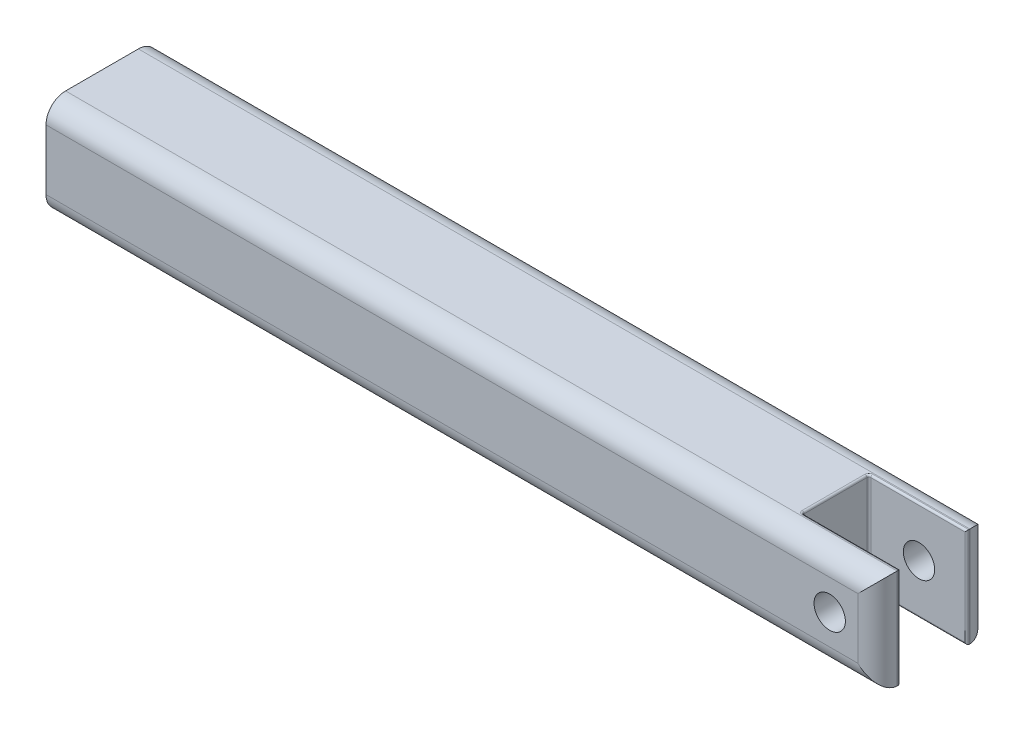
ISO-10303-21;
HEADER;
FILE_DESCRIPTION(('STEP AP214'),'2;1');
FILE_NAME('part.step','',(''),(''),'','','');
FILE_SCHEMA(('AUTOMOTIVE_DESIGN { 1 0 10303 214 1 1 1 1 }'));
ENDSEC;
DATA;
#1=APPLICATION_CONTEXT('core data for automotive mechanical design processes');
#2=APPLICATION_PROTOCOL_DEFINITION('international standard','automotive_design',2000,#1);
#3=PRODUCT_CONTEXT('',#1,'mechanical');
#4=PRODUCT('Part','Part','',(#3));
#5=PRODUCT_RELATED_PRODUCT_CATEGORY('part','',(#4));
#6=PRODUCT_DEFINITION_FORMATION('','',#4);
#7=PRODUCT_DEFINITION_CONTEXT('part definition',#1,'design');
#8=PRODUCT_DEFINITION('design','',#6,#7);
#9=PRODUCT_DEFINITION_SHAPE('','',#8);
#10=(LENGTH_UNIT() NAMED_UNIT(*) SI_UNIT(.MILLI.,.METRE.));
#11=(NAMED_UNIT(*) PLANE_ANGLE_UNIT() SI_UNIT($,.RADIAN.));
#12=(NAMED_UNIT(*) SI_UNIT($,.STERADIAN.) SOLID_ANGLE_UNIT());
#13=UNCERTAINTY_MEASURE_WITH_UNIT(LENGTH_MEASURE(1.E-05),#10,'distance_accuracy_value','');
#14=(GEOMETRIC_REPRESENTATION_CONTEXT(3) GLOBAL_UNCERTAINTY_ASSIGNED_CONTEXT((#13)) GLOBAL_UNIT_ASSIGNED_CONTEXT((#10,
#11,#12)) REPRESENTATION_CONTEXT('',''));
#15=CARTESIAN_POINT('',(0.,0.,0.));
#16=DIRECTION('',(0.,0.,1.));
#17=DIRECTION('',(1.,0.,0.));
#18=AXIS2_PLACEMENT_3D('',#15,#16,#17);
#19=CARTESIAN_POINT('',(106.1,-12.7,14.2875));
#20=DIRECTION('',(-1.,0.,0.));
#21=DIRECTION('',(0.,0.,1.));
#22=AXIS2_PLACEMENT_3D('',#19,#20,#21);
#23=PLANE('',#22);
#24=DIRECTION('',(0.,0.,-1.));
#25=VECTOR('',#24,1.);
#26=CARTESIAN_POINT('',(106.1,-12.7,14.2875));
#27=LINE('',#26,#25);
#28=CARTESIAN_POINT('',(106.1,-12.7,9.2875));
#29=VERTEX_POINT('',#28);
#30=CARTESIAN_POINT('',(106.1,-12.7,9.00000000000001));
#31=VERTEX_POINT('',#30);
#32=EDGE_CURVE('E217',#29,#31,#27,.T.);
#33=ORIENTED_EDGE('',*,*,#32,.T.);
#34=DIRECTION('',(0.,1.,0.));
#35=VECTOR('',#34,1.);
#36=CARTESIAN_POINT('',(106.1,-12.7,9.00000000000001));
#37=LINE('',#36,#35);
#38=CARTESIAN_POINT('',(106.1,12.7,9.00000000000001));
#39=VERTEX_POINT('',#38);
#40=EDGE_CURVE('E294',#31,#39,#37,.T.);
#41=ORIENTED_EDGE('',*,*,#40,.T.);
#42=DIRECTION('',(0.,0.,-1.));
#43=VECTOR('',#42,1.);
#44=CARTESIAN_POINT('',(106.1,12.7,14.2875));
#45=LINE('',#44,#43);
#46=CARTESIAN_POINT('',(106.1,12.7,9.2875));
#47=VERTEX_POINT('',#46);
#48=EDGE_CURVE('E185',#47,#39,#45,.T.);
#49=ORIENTED_EDGE('',*,*,#48,.F.);
#50=DIRECTION('',(0.,1.,0.));
#51=VECTOR('',#50,1.);
#52=CARTESIAN_POINT('',(106.1,-12.7,9.2875));
#53=LINE('',#52,#51);
#54=EDGE_CURVE('E233',#47,#29,#53,.F.);
#55=ORIENTED_EDGE('',*,*,#54,.T.);
#56=EDGE_LOOP('',(#33,#41,#49,#55));
#57=FACE_BOUND('',#56,.T.);
#58=ADVANCED_FACE('F33',(#57),#23,.F.);
#59=CARTESIAN_POINT('',(93.9,0.,-14.2875));
#60=DIRECTION('',(0.,0.,1.));
#61=DIRECTION('',(1.,0.,0.));
#62=AXIS2_PLACEMENT_3D('',#59,#60,#61);
#63=CYLINDRICAL_SURFACE('',#62,4.00000000000001);
#64=CARTESIAN_POINT('',(93.9,0.,8.50000000000001));
#65=DIRECTION('',(0.,0.,1.));
#66=DIRECTION('',(1.,0.,0.));
#67=AXIS2_PLACEMENT_3D('',#64,#65,#66);
#68=CIRCLE('',#67,4.00000000000001);
#69=CARTESIAN_POINT('',(97.9,0.,8.50000000000001));
#70=VERTEX_POINT('',#69);
#71=EDGE_CURVE('E220',#70,#70,#68,.F.);
#72=CARTESIAN_POINT('',(93.9,0.,14.2875));
#73=DIRECTION('',(0.,0.,1.));
#74=DIRECTION('',(1.,0.,0.));
#75=AXIS2_PLACEMENT_3D('',#72,#73,#74);
#76=CIRCLE('',#75,4.00000000000001);
#77=CARTESIAN_POINT('',(97.9,0.,14.2875));
#78=VERTEX_POINT('',#77);
#79=EDGE_CURVE('E380',#78,#78,#76,.T.);
#80=CARTESIAN_POINT('',(97.9,0.,8.50000000000001));
#81=CARTESIAN_POINT('',(97.9,0.,8.56028645833334));
#82=CARTESIAN_POINT('',(97.9,0.,8.62057291666668));
#83=CARTESIAN_POINT('',(97.9,0.,8.74114583333334));
#84=CARTESIAN_POINT('',(97.9,0.,8.80143229166668));
#85=CARTESIAN_POINT('',(97.9,0.,8.92200520833334));
#86=CARTESIAN_POINT('',(97.9,0.,8.98229166666668));
#87=CARTESIAN_POINT('',(97.9,0.,9.10286458333334));
#88=CARTESIAN_POINT('',(97.9,0.,9.16315104166668));
#89=CARTESIAN_POINT('',(97.9,0.,9.28372395833334));
#90=CARTESIAN_POINT('',(97.9,0.,9.34401041666668));
#91=CARTESIAN_POINT('',(97.9,0.,9.46458333333334));
#92=CARTESIAN_POINT('',(97.9,0.,9.52486979166667));
#93=CARTESIAN_POINT('',(97.9,0.,9.64544270833334));
#94=CARTESIAN_POINT('',(97.9,0.,9.70572916666667));
#95=CARTESIAN_POINT('',(97.9,0.,9.82630208333334));
#96=CARTESIAN_POINT('',(97.9,0.,9.88658854166668));
#97=CARTESIAN_POINT('',(97.9,0.,10.0071614583333));
#98=CARTESIAN_POINT('',(97.9,0.,10.0674479166667));
#99=CARTESIAN_POINT('',(97.9,0.,10.1880208333333));
#100=CARTESIAN_POINT('',(97.9,0.,10.2483072916667));
#101=CARTESIAN_POINT('',(97.9,0.,10.3688802083333));
#102=CARTESIAN_POINT('',(97.9,0.,10.4291666666667));
#103=CARTESIAN_POINT('',(97.9,0.,10.5497395833333));
#104=CARTESIAN_POINT('',(97.9,0.,10.6100260416667));
#105=CARTESIAN_POINT('',(97.9,0.,10.7305989583333));
#106=CARTESIAN_POINT('',(97.9,0.,10.7908854166667));
#107=CARTESIAN_POINT('',(97.9,0.,10.9114583333333));
#108=CARTESIAN_POINT('',(97.9,0.,10.9717447916667));
#109=CARTESIAN_POINT('',(97.9,0.,11.0923177083333));
#110=CARTESIAN_POINT('',(97.9,0.,11.1526041666667));
#111=CARTESIAN_POINT('',(97.9,0.,11.2731770833333));
#112=CARTESIAN_POINT('',(97.9,0.,11.3334635416667));
#113=CARTESIAN_POINT('',(97.9,0.,11.4540364583333));
#114=CARTESIAN_POINT('',(97.9,0.,11.5143229166667));
#115=CARTESIAN_POINT('',(97.9,0.,11.6348958333333));
#116=CARTESIAN_POINT('',(97.9,0.,11.6951822916667));
#117=CARTESIAN_POINT('',(97.9,0.,11.8157552083333));
#118=CARTESIAN_POINT('',(97.9,0.,11.8760416666667));
#119=CARTESIAN_POINT('',(97.9,0.,11.9966145833333));
#120=CARTESIAN_POINT('',(97.9,0.,12.0569010416667));
#121=CARTESIAN_POINT('',(97.9,0.,12.1774739583333));
#122=CARTESIAN_POINT('',(97.9,0.,12.2377604166667));
#123=CARTESIAN_POINT('',(97.9,0.,12.3583333333333));
#124=CARTESIAN_POINT('',(97.9,0.,12.4186197916667));
#125=CARTESIAN_POINT('',(97.9,0.,12.5391927083333));
#126=CARTESIAN_POINT('',(97.9,0.,12.5994791666667));
#127=CARTESIAN_POINT('',(97.9,0.,12.7200520833333));
#128=CARTESIAN_POINT('',(97.9,0.,12.7803385416667));
#129=CARTESIAN_POINT('',(97.9,0.,12.9009114583333));
#130=CARTESIAN_POINT('',(97.9,0.,12.9611979166667));
#131=CARTESIAN_POINT('',(97.9,0.,13.0817708333333));
#132=CARTESIAN_POINT('',(97.9,0.,13.1420572916667));
#133=CARTESIAN_POINT('',(97.9,0.,13.2626302083333));
#134=CARTESIAN_POINT('',(97.9,0.,13.3229166666667));
#135=CARTESIAN_POINT('',(97.9,0.,13.4434895833333));
#136=CARTESIAN_POINT('',(97.9,0.,13.5037760416667));
#137=CARTESIAN_POINT('',(97.9,0.,13.6243489583333));
#138=CARTESIAN_POINT('',(97.9,0.,13.6846354166667));
#139=CARTESIAN_POINT('',(97.9,0.,13.8052083333333));
#140=CARTESIAN_POINT('',(97.9,0.,13.8654947916667));
#141=CARTESIAN_POINT('',(97.9,0.,13.9860677083333));
#142=CARTESIAN_POINT('',(97.9,0.,14.0463541666667));
#143=CARTESIAN_POINT('',(97.9,0.,14.1669270833333));
#144=CARTESIAN_POINT('',(97.9,0.,14.2272135416667));
#145=CARTESIAN_POINT('',(97.9,0.,14.2875));
#146=B_SPLINE_CURVE_WITH_KNOTS('',3,(#80,#81,#82,#83,#84,#85,#86,#87,#88,#89,#90,#91,#92,#93,
#94,#95,#96,#97,#98,#99,#100,#101,#102,#103,#104,#105,#106,#107,#108,#109,#110,#111,#112,#113,
#114,#115,#116,#117,#118,#119,#120,#121,#122,#123,#124,#125,#126,#127,#128,#129,#130,#131,#132,
#133,#134,#135,#136,#137,#138,#139,#140,#141,#142,#143,#144,#145),.UNSPECIFIED.,.F.,.F.,(4,2,2,
2,2,2,2,2,2,2,2,2,2,2,2,2,2,2,2,2,2,2,2,2,2,2,2,2,2,2,2,2,4),(0.,0.180859374999998,0.36171875,
0.542578124999998,0.7234375,0.904296874999998,1.08515625,1.266015625,1.446875,1.627734375,
1.80859375,1.989453125,2.17031249999999,2.351171875,2.53203124999999,2.712890625,
2.89374999999999,3.07460937499999,3.25546874999999,3.43632812499999,3.61718749999999,
3.79804687499999,3.97890624999999,4.15976562499999,4.34062499999999,4.52148437499999,
4.70234374999999,4.88320312499999,5.06406249999999,5.24492187499999,5.42578124999999,
5.60664062499999,5.78749999999999),.UNSPECIFIED.);
#147=EDGE_CURVE('BSEAM438',#70,#78,#146,.T.);
#148=ORIENTED_EDGE('',*,*,#71,.T.);
#149=ORIENTED_EDGE('',*,*,#79,.T.);
#150=ORIENTED_EDGE('',*,*,#147,.T.);
#151=ORIENTED_EDGE('',*,*,#147,.F.);
#152=EDGE_LOOP('',(#148,#150,#149,#151));
#153=FACE_BOUND('',#152,.T.);
#154=ADVANCED_FACE('F438',(#153),#63,.F.);
#155=CARTESIAN_POINT('',(-106.1,-12.7,14.2875));
#156=DIRECTION('',(1.,0.,0.));
#157=DIRECTION('',(0.,0.,-1.));
#158=AXIS2_PLACEMENT_3D('',#155,#156,#157);
#159=PLANE('',#158);
#160=DIRECTION('',(0.,0.,-1.));
#161=VECTOR('',#160,1.);
#162=CARTESIAN_POINT('',(-106.1,-12.7,14.2875));
#163=LINE('',#162,#161);
#164=CARTESIAN_POINT('',(-106.1,-12.7,9.2875));
#165=VERTEX_POINT('',#164);
#166=CARTESIAN_POINT('',(-106.1,-12.7,-9.28749999999999));
#167=VERTEX_POINT('',#166);
#168=EDGE_CURVE('E213',#165,#167,#163,.T.);
#169=ORIENTED_EDGE('',*,*,#168,.F.);
#170=CARTESIAN_POINT('',(-106.1,-7.7,9.2875));
#171=DIRECTION('',(1.,0.,0.));
#172=DIRECTION('',(0.,0.,-1.));
#173=AXIS2_PLACEMENT_3D('',#170,#171,#172);
#174=CIRCLE('',#173,5.);
#175=CARTESIAN_POINT('',(-106.1,-7.7,14.2875));
#176=VERTEX_POINT('',#175);
#177=EDGE_CURVE('E244',#165,#176,#174,.F.);
#178=ORIENTED_EDGE('',*,*,#177,.T.);
#179=DIRECTION('',(0.,-1.,0.));
#180=VECTOR('',#179,1.);
#181=CARTESIAN_POINT('',(-106.1,-12.7,14.2875));
#182=LINE('',#181,#180);
#183=CARTESIAN_POINT('',(-106.1,7.7,14.2875));
#184=VERTEX_POINT('',#183);
#185=EDGE_CURVE('E392',#184,#176,#182,.T.);
#186=ORIENTED_EDGE('',*,*,#185,.F.);
#187=CARTESIAN_POINT('',(-106.1,7.7,9.2875));
#188=DIRECTION('',(1.,0.,0.));
#189=DIRECTION('',(0.,0.,-1.));
#190=AXIS2_PLACEMENT_3D('',#187,#188,#189);
#191=CIRCLE('',#190,5.);
#192=CARTESIAN_POINT('',(-106.1,12.7,9.2875));
#193=VERTEX_POINT('',#192);
#194=EDGE_CURVE('E239',#184,#193,#191,.F.);
#195=ORIENTED_EDGE('',*,*,#194,.T.);
#196=DIRECTION('',(0.,0.,-1.));
#197=VECTOR('',#196,1.);
#198=CARTESIAN_POINT('',(-106.1,12.7,14.2875));
#199=LINE('',#198,#197);
#200=CARTESIAN_POINT('',(-106.1,12.7,-9.28749999999999));
#201=VERTEX_POINT('',#200);
#202=EDGE_CURVE('E186',#193,#201,#199,.T.);
#203=ORIENTED_EDGE('',*,*,#202,.T.);
#204=CARTESIAN_POINT('',(-106.1,7.7,-9.2875));
#205=DIRECTION('',(1.,0.,0.));
#206=DIRECTION('',(0.,0.,-1.));
#207=AXIS2_PLACEMENT_3D('',#204,#205,#206);
#208=CIRCLE('',#207,5.);
#209=CARTESIAN_POINT('',(-106.1,7.7,-14.2875));
#210=VERTEX_POINT('',#209);
#211=EDGE_CURVE('E204',#201,#210,#208,.F.);
#212=ORIENTED_EDGE('',*,*,#211,.T.);
#213=DIRECTION('',(0.,-1.,0.));
#214=VECTOR('',#213,1.);
#215=CARTESIAN_POINT('',(-106.1,-12.7,-14.2875));
#216=LINE('',#215,#214);
#217=CARTESIAN_POINT('',(-106.1,-7.7,-14.2875));
#218=VERTEX_POINT('',#217);
#219=EDGE_CURVE('E389',#210,#218,#216,.T.);
#220=ORIENTED_EDGE('',*,*,#219,.T.);
#221=CARTESIAN_POINT('',(-106.1,-7.7,-9.2875));
#222=DIRECTION('',(1.,0.,0.));
#223=DIRECTION('',(0.,0.,-1.));
#224=AXIS2_PLACEMENT_3D('',#221,#222,#223);
#225=CIRCLE('',#224,5.);
#226=EDGE_CURVE('E242',#218,#167,#225,.F.);
#227=ORIENTED_EDGE('',*,*,#226,.T.);
#228=EDGE_LOOP('',(#169,#178,#186,#195,#203,#212,#220,#227));
#229=FACE_BOUND('',#228,.T.);
#230=ADVANCED_FACE('F398',(#229),#159,.F.);
#231=CARTESIAN_POINT('',(106.1,-12.7,14.2875));
#232=DIRECTION('',(0.,1.,0.));
#233=DIRECTION('',(0.,0.,1.));
#234=AXIS2_PLACEMENT_3D('',#231,#232,#233);
#235=PLANE('',#234);
#236=CARTESIAN_POINT('',(106.1,-12.7,-9.));
#237=VERTEX_POINT('',#236);
#238=CARTESIAN_POINT('',(106.1,-12.7,-9.28749999999999));
#239=VERTEX_POINT('',#238);
#240=EDGE_CURVE('E210',#237,#239,#27,.T.);
#241=ORIENTED_EDGE('',*,*,#240,.F.);
#242=DIRECTION('',(-1.,0.,0.));
#243=VECTOR('',#242,1.);
#244=CARTESIAN_POINT('',(106.1,-12.7,-9.00000000000001));
#245=LINE('',#244,#243);
#246=CARTESIAN_POINT('',(81.6,-12.7,-9.00000000000001));
#247=VERTEX_POINT('',#246);
#248=EDGE_CURVE('E263',#237,#247,#245,.T.);
#249=ORIENTED_EDGE('',*,*,#248,.T.);
#250=CARTESIAN_POINT('',(81.6,-12.7,-8.));
#251=DIRECTION('',(0.,1.,0.));
#252=DIRECTION('',(0.,0.,1.));
#253=AXIS2_PLACEMENT_3D('',#250,#251,#252);
#254=CIRCLE('',#253,1.);
#255=CARTESIAN_POINT('',(80.6,-12.7,-8.));
#256=VERTEX_POINT('',#255);
#257=EDGE_CURVE('E260',#256,#247,#254,.F.);
#258=ORIENTED_EDGE('',*,*,#257,.F.);
#259=DIRECTION('',(0.,0.,1.));
#260=VECTOR('',#259,1.);
#261=CARTESIAN_POINT('',(80.6,-12.7,14.2875));
#262=LINE('',#261,#260);
#263=CARTESIAN_POINT('',(80.6,-12.7,8.));
#264=VERTEX_POINT('',#263);
#265=EDGE_CURVE('E257',#256,#264,#262,.T.);
#266=ORIENTED_EDGE('',*,*,#265,.T.);
#267=CARTESIAN_POINT('',(81.6,-12.7,8.));
#268=DIRECTION('',(0.,1.,0.));
#269=DIRECTION('',(0.,0.,1.));
#270=AXIS2_PLACEMENT_3D('',#267,#268,#269);
#271=CIRCLE('',#270,1.);
#272=CARTESIAN_POINT('',(81.6,-12.7,9.00000000000001));
#273=VERTEX_POINT('',#272);
#274=EDGE_CURVE('E254',#273,#264,#271,.F.);
#275=ORIENTED_EDGE('',*,*,#274,.F.);
#276=DIRECTION('',(1.,0.,0.));
#277=VECTOR('',#276,1.);
#278=CARTESIAN_POINT('',(106.1,-12.7,9.00000000000001));
#279=LINE('',#278,#277);
#280=EDGE_CURVE('E205',#273,#31,#279,.T.);
#281=ORIENTED_EDGE('',*,*,#280,.T.);
#282=ORIENTED_EDGE('',*,*,#32,.F.);
#283=DIRECTION('',(1.,0.,0.));
#284=VECTOR('',#283,1.);
#285=CARTESIAN_POINT('',(-106.1,-12.7,9.2875));
#286=LINE('',#285,#284);
#287=EDGE_CURVE('E237',#29,#165,#286,.F.);
#288=ORIENTED_EDGE('',*,*,#287,.T.);
#289=ORIENTED_EDGE('',*,*,#168,.T.);
#290=DIRECTION('',(1.,0.,0.));
#291=VECTOR('',#290,1.);
#292=CARTESIAN_POINT('',(106.1,-12.7,-9.2875));
#293=LINE('',#292,#291);
#294=EDGE_CURVE('E235',#167,#239,#293,.T.);
#295=ORIENTED_EDGE('',*,*,#294,.T.);
#296=EDGE_LOOP('',(#241,#249,#258,#266,#275,#281,#282,#288,#289,#295));
#297=FACE_BOUND('',#296,.T.);
#298=ADVANCED_FACE('F370',(#297),#235,.F.);
#299=CARTESIAN_POINT('',(106.1,12.7,-9.));
#300=VERTEX_POINT('',#299);
#301=CARTESIAN_POINT('',(106.1,12.7,-9.28749999999999));
#302=VERTEX_POINT('',#301);
#303=EDGE_CURVE('E172',#300,#302,#45,.T.);
#304=ORIENTED_EDGE('',*,*,#303,.F.);
#305=DIRECTION('',(0.,1.,0.));
#306=VECTOR('',#305,1.);
#307=CARTESIAN_POINT('',(106.1,-12.7,-9.00000000000001));
#308=LINE('',#307,#306);
#309=EDGE_CURVE('E11',#300,#237,#308,.F.);
#310=ORIENTED_EDGE('',*,*,#309,.T.);
#311=ORIENTED_EDGE('',*,*,#240,.T.);
#312=DIRECTION('',(0.,1.,0.));
#313=VECTOR('',#312,1.);
#314=CARTESIAN_POINT('',(106.1,-12.7,-9.2875));
#315=LINE('',#314,#313);
#316=EDGE_CURVE('E195',#239,#302,#315,.T.);
#317=ORIENTED_EDGE('',*,*,#316,.T.);
#318=EDGE_LOOP('',(#304,#310,#311,#317));
#319=FACE_BOUND('',#318,.T.);
#320=ADVANCED_FACE('F208',(#319),#23,.F.);
#321=CARTESIAN_POINT('',(106.1,12.7,14.2875));
#322=DIRECTION('',(0.,-1.,0.));
#323=DIRECTION('',(0.,0.,-1.));
#324=AXIS2_PLACEMENT_3D('',#321,#322,#323);
#325=PLANE('',#324);
#326=ORIENTED_EDGE('',*,*,#48,.T.);
#327=DIRECTION('',(1.,0.,0.));
#328=VECTOR('',#327,1.);
#329=CARTESIAN_POINT('',(106.1,12.7,9.00000000000001));
#330=LINE('',#329,#328);
#331=CARTESIAN_POINT('',(81.6,12.7,9.00000000000001));
#332=VERTEX_POINT('',#331);
#333=EDGE_CURVE('E283',#39,#332,#330,.F.);
#334=ORIENTED_EDGE('',*,*,#333,.T.);
#335=CARTESIAN_POINT('',(81.6,12.7,8.));
#336=DIRECTION('',(0.,-1.,0.));
#337=DIRECTION('',(0.,0.,-1.));
#338=AXIS2_PLACEMENT_3D('',#335,#336,#337);
#339=CIRCLE('',#338,1.);
#340=CARTESIAN_POINT('',(80.6,12.7,8.));
#341=VERTEX_POINT('',#340);
#342=EDGE_CURVE('E280',#341,#332,#339,.F.);
#343=ORIENTED_EDGE('',*,*,#342,.F.);
#344=DIRECTION('',(0.,0.,1.));
#345=VECTOR('',#344,1.);
#346=CARTESIAN_POINT('',(80.6,12.7,14.2875));
#347=LINE('',#346,#345);
#348=CARTESIAN_POINT('',(80.6,12.7,-8.));
#349=VERTEX_POINT('',#348);
#350=EDGE_CURVE('E278',#341,#349,#347,.F.);
#351=ORIENTED_EDGE('',*,*,#350,.T.);
#352=CARTESIAN_POINT('',(81.6,12.7,-8.));
#353=DIRECTION('',(0.,-1.,0.));
#354=DIRECTION('',(0.,0.,-1.));
#355=AXIS2_PLACEMENT_3D('',#352,#353,#354);
#356=CIRCLE('',#355,1.);
#357=CARTESIAN_POINT('',(81.6,12.7,-9.00000000000001));
#358=VERTEX_POINT('',#357);
#359=EDGE_CURVE('E275',#358,#349,#356,.F.);
#360=ORIENTED_EDGE('',*,*,#359,.F.);
#361=DIRECTION('',(-1.,0.,0.));
#362=VECTOR('',#361,1.);
#363=CARTESIAN_POINT('',(106.1,12.7,-9.00000000000001));
#364=LINE('',#363,#362);
#365=EDGE_CURVE('E181',#358,#300,#364,.F.);
#366=ORIENTED_EDGE('',*,*,#365,.T.);
#367=ORIENTED_EDGE('',*,*,#303,.T.);
#368=DIRECTION('',(-1.,0.,0.));
#369=VECTOR('',#368,1.);
#370=CARTESIAN_POINT('',(106.1,12.7,-9.2875));
#371=LINE('',#370,#369);
#372=EDGE_CURVE('E178',#302,#201,#371,.T.);
#373=ORIENTED_EDGE('',*,*,#372,.T.);
#374=ORIENTED_EDGE('',*,*,#202,.F.);
#375=DIRECTION('',(-1.,0.,0.));
#376=VECTOR('',#375,1.);
#377=CARTESIAN_POINT('',(106.1,12.7,9.2875));
#378=LINE('',#377,#376);
#379=EDGE_CURVE('E206',#193,#47,#378,.F.);
#380=ORIENTED_EDGE('',*,*,#379,.T.);
#381=EDGE_LOOP('',(#326,#334,#343,#351,#360,#366,#367,#373,#374,#380));
#382=FACE_BOUND('',#381,.T.);
#383=ADVANCED_FACE('F175',(#382),#325,.F.);
#384=CARTESIAN_POINT('',(0.,0.,14.2875));
#385=DIRECTION('',(0.,0.,1.));
#386=DIRECTION('',(1.,0.,0.));
#387=AXIS2_PLACEMENT_3D('',#384,#385,#386);
#388=PLANE('',#387);
#389=ORIENTED_EDGE('',*,*,#79,.F.);
#390=EDGE_LOOP('',(#389));
#391=FACE_BOUND('',#390,.T.);
#392=ORIENTED_EDGE('',*,*,#185,.T.);
#393=DIRECTION('',(1.,0.,0.));
#394=VECTOR('',#393,1.);
#395=CARTESIAN_POINT('',(106.1,-7.7,14.2875));
#396=LINE('',#395,#394);
#397=CARTESIAN_POINT('',(101.1,-7.7,14.2875));
#398=VERTEX_POINT('',#397);
#399=EDGE_CURVE('E231',#176,#398,#396,.T.);
#400=ORIENTED_EDGE('',*,*,#399,.T.);
#401=DIRECTION('',(0.,1.,0.));
#402=VECTOR('',#401,1.);
#403=CARTESIAN_POINT('',(101.1,12.7,14.2875));
#404=LINE('',#403,#402);
#405=CARTESIAN_POINT('',(101.1,7.7,14.2875));
#406=VERTEX_POINT('',#405);
#407=EDGE_CURVE('E228',#398,#406,#404,.T.);
#408=ORIENTED_EDGE('',*,*,#407,.T.);
#409=DIRECTION('',(-1.,0.,0.));
#410=VECTOR('',#409,1.);
#411=CARTESIAN_POINT('',(-106.1,7.7,14.2875));
#412=LINE('',#411,#410);
#413=EDGE_CURVE('E226',#406,#184,#412,.T.);
#414=ORIENTED_EDGE('',*,*,#413,.T.);
#415=EDGE_LOOP('',(#392,#400,#408,#414));
#416=FACE_BOUND('',#415,.T.);
#417=ADVANCED_FACE('F423',(#391,#416),#388,.T.);
#418=CARTESIAN_POINT('',(0.,0.,-14.2875));
#419=DIRECTION('',(0.,0.,1.));
#420=DIRECTION('',(1.,0.,0.));
#421=AXIS2_PLACEMENT_3D('',#418,#419,#420);
#422=PLANE('',#421);
#423=CARTESIAN_POINT('',(93.9,0.,-14.2875));
#424=DIRECTION('',(0.,0.,1.));
#425=DIRECTION('',(1.,0.,0.));
#426=AXIS2_PLACEMENT_3D('',#423,#424,#425);
#427=CIRCLE('',#426,4.00000000000001);
#428=CARTESIAN_POINT('',(97.9,0.,-14.2875));
#429=VERTEX_POINT('',#428);
#430=EDGE_CURVE('E384',#429,#429,#427,.T.);
#431=ORIENTED_EDGE('',*,*,#430,.T.);
#432=EDGE_LOOP('',(#431));
#433=FACE_BOUND('',#432,.T.);
#434=DIRECTION('',(0.,1.,0.));
#435=VECTOR('',#434,1.);
#436=CARTESIAN_POINT('',(101.1,0.,-14.2875));
#437=LINE('',#436,#435);
#438=CARTESIAN_POINT('',(101.1,7.7,-14.2875));
#439=VERTEX_POINT('',#438);
#440=CARTESIAN_POINT('',(101.1,-7.7,-14.2875));
#441=VERTEX_POINT('',#440);
#442=EDGE_CURVE('E196',#439,#441,#437,.F.);
#443=ORIENTED_EDGE('',*,*,#442,.T.);
#444=DIRECTION('',(1.,0.,0.));
#445=VECTOR('',#444,1.);
#446=CARTESIAN_POINT('',(0.,-7.7,-14.2875));
#447=LINE('',#446,#445);
#448=EDGE_CURVE('E224',#441,#218,#447,.F.);
#449=ORIENTED_EDGE('',*,*,#448,.T.);
#450=ORIENTED_EDGE('',*,*,#219,.F.);
#451=DIRECTION('',(-1.,0.,0.));
#452=VECTOR('',#451,1.);
#453=CARTESIAN_POINT('',(0.,7.7,-14.2875));
#454=LINE('',#453,#452);
#455=EDGE_CURVE('E212',#210,#439,#454,.F.);
#456=ORIENTED_EDGE('',*,*,#455,.T.);
#457=EDGE_LOOP('',(#443,#449,#450,#456));
#458=FACE_BOUND('',#457,.T.);
#459=ADVANCED_FACE('F425',(#433,#458),#422,.F.);
#460=CARTESIAN_POINT('',(93.9,0.,-8.50000000000001));
#461=DIRECTION('',(0.,0.,-1.));
#462=DIRECTION('',(-1.,0.,0.));
#463=AXIS2_PLACEMENT_3D('',#460,#461,#462);
#464=CIRCLE('',#463,4.00000000000001);
#465=CARTESIAN_POINT('',(97.9,0.,-8.50000000000001));
#466=VERTEX_POINT('',#465);
#467=EDGE_CURVE('E248',#466,#466,#464,.F.);
#468=CARTESIAN_POINT('',(97.9,0.,-8.50000000000001));
#469=CARTESIAN_POINT('',(97.9,0.,-8.56028645833334));
#470=CARTESIAN_POINT('',(97.9,0.,-8.62057291666667));
#471=CARTESIAN_POINT('',(97.9,0.,-8.74114583333334));
#472=CARTESIAN_POINT('',(97.9,0.,-8.80143229166667));
#473=CARTESIAN_POINT('',(97.9,0.,-8.92200520833334));
#474=CARTESIAN_POINT('',(97.9,0.,-8.98229166666667));
#475=CARTESIAN_POINT('',(97.9,0.,-9.10286458333334));
#476=CARTESIAN_POINT('',(97.9,0.,-9.16315104166667));
#477=CARTESIAN_POINT('',(97.9,0.,-9.28372395833334));
#478=CARTESIAN_POINT('',(97.9,0.,-9.34401041666667));
#479=CARTESIAN_POINT('',(97.9,0.,-9.46458333333334));
#480=CARTESIAN_POINT('',(97.9,0.,-9.52486979166667));
#481=CARTESIAN_POINT('',(97.9,0.,-9.64544270833334));
#482=CARTESIAN_POINT('',(97.9,0.,-9.70572916666667));
#483=CARTESIAN_POINT('',(97.9,0.,-9.82630208333334));
#484=CARTESIAN_POINT('',(97.9,0.,-9.88658854166667));
#485=CARTESIAN_POINT('',(97.9,0.,-10.0071614583333));
#486=CARTESIAN_POINT('',(97.9,0.,-10.0674479166667));
#487=CARTESIAN_POINT('',(97.9,0.,-10.1880208333333));
#488=CARTESIAN_POINT('',(97.9,0.,-10.2483072916667));
#489=CARTESIAN_POINT('',(97.9,0.,-10.3688802083333));
#490=CARTESIAN_POINT('',(97.9,0.,-10.4291666666667));
#491=CARTESIAN_POINT('',(97.9,0.,-10.5497395833333));
#492=CARTESIAN_POINT('',(97.9,0.,-10.6100260416667));
#493=CARTESIAN_POINT('',(97.9,0.,-10.7305989583333));
#494=CARTESIAN_POINT('',(97.9,0.,-10.7908854166667));
#495=CARTESIAN_POINT('',(97.9,0.,-10.9114583333333));
#496=CARTESIAN_POINT('',(97.9,0.,-10.9717447916667));
#497=CARTESIAN_POINT('',(97.9,0.,-11.0923177083333));
#498=CARTESIAN_POINT('',(97.9,0.,-11.1526041666667));
#499=CARTESIAN_POINT('',(97.9,0.,-11.2731770833333));
#500=CARTESIAN_POINT('',(97.9,0.,-11.3334635416667));
#501=CARTESIAN_POINT('',(97.9,0.,-11.4540364583333));
#502=CARTESIAN_POINT('',(97.9,0.,-11.5143229166667));
#503=CARTESIAN_POINT('',(97.9,0.,-11.6348958333333));
#504=CARTESIAN_POINT('',(97.9,0.,-11.6951822916667));
#505=CARTESIAN_POINT('',(97.9,0.,-11.8157552083333));
#506=CARTESIAN_POINT('',(97.9,0.,-11.8760416666667));
#507=CARTESIAN_POINT('',(97.9,0.,-11.9966145833333));
#508=CARTESIAN_POINT('',(97.9,0.,-12.0569010416667));
#509=CARTESIAN_POINT('',(97.9,0.,-12.1774739583333));
#510=CARTESIAN_POINT('',(97.9,0.,-12.2377604166667));
#511=CARTESIAN_POINT('',(97.9,0.,-12.3583333333333));
#512=CARTESIAN_POINT('',(97.9,0.,-12.4186197916667));
#513=CARTESIAN_POINT('',(97.9,0.,-12.5391927083333));
#514=CARTESIAN_POINT('',(97.9,0.,-12.5994791666667));
#515=CARTESIAN_POINT('',(97.9,0.,-12.7200520833333));
#516=CARTESIAN_POINT('',(97.9,0.,-12.7803385416667));
#517=CARTESIAN_POINT('',(97.9,0.,-12.9009114583333));
#518=CARTESIAN_POINT('',(97.9,0.,-12.9611979166667));
#519=CARTESIAN_POINT('',(97.9,0.,-13.0817708333333));
#520=CARTESIAN_POINT('',(97.9,0.,-13.1420572916667));
#521=CARTESIAN_POINT('',(97.9,0.,-13.2626302083333));
#522=CARTESIAN_POINT('',(97.9,0.,-13.3229166666667));
#523=CARTESIAN_POINT('',(97.9,0.,-13.4434895833333));
#524=CARTESIAN_POINT('',(97.9,0.,-13.5037760416667));
#525=CARTESIAN_POINT('',(97.9,0.,-13.6243489583333));
#526=CARTESIAN_POINT('',(97.9,0.,-13.6846354166667));
#527=CARTESIAN_POINT('',(97.9,0.,-13.8052083333333));
#528=CARTESIAN_POINT('',(97.9,0.,-13.8654947916667));
#529=CARTESIAN_POINT('',(97.9,0.,-13.9860677083333));
#530=CARTESIAN_POINT('',(97.9,0.,-14.0463541666667));
#531=CARTESIAN_POINT('',(97.9,0.,-14.1669270833333));
#532=CARTESIAN_POINT('',(97.9,0.,-14.2272135416667));
#533=CARTESIAN_POINT('',(97.9,0.,-14.2875));
#534=B_SPLINE_CURVE_WITH_KNOTS('',3,(#468,#469,#470,#471,#472,#473,#474,#475,#476,#477,#478,
#479,#480,#481,#482,#483,#484,#485,#486,#487,#488,#489,#490,#491,#492,#493,#494,#495,#496,#497,
#498,#499,#500,#501,#502,#503,#504,#505,#506,#507,#508,#509,#510,#511,#512,#513,#514,#515,#516,
#517,#518,#519,#520,#521,#522,#523,#524,#525,#526,#527,#528,#529,#530,#531,#532,#533),
.UNSPECIFIED.,.F.,.F.,(4,2,2,2,2,2,2,2,2,2,2,2,2,2,2,2,2,2,2,2,2,2,2,2,2,2,2,2,2,2,2,2,4),(0.,
0.180859374999998,0.36171875,0.542578124999998,0.723437499999998,0.904296874999998,1.08515625,
1.266015625,1.446875,1.627734375,1.80859375,1.989453125,2.1703125,2.351171875,2.53203125,
2.712890625,2.89375,3.074609375,3.25546875,3.436328125,3.6171875,3.798046875,3.97890625,
4.159765625,4.340625,4.521484375,4.70234375,4.883203125,5.0640625,5.244921875,5.42578125,
5.606640625,5.78749999999999),.UNSPECIFIED.);
#535=EDGE_CURVE('BSEAM432',#466,#429,#534,.T.);
#536=ORIENTED_EDGE('',*,*,#467,.T.);
#537=ORIENTED_EDGE('',*,*,#430,.F.);
#538=ORIENTED_EDGE('',*,*,#535,.T.);
#539=ORIENTED_EDGE('',*,*,#535,.F.);
#540=EDGE_LOOP('',(#536,#538,#537,#539));
#541=FACE_BOUND('',#540,.T.);
#542=ADVANCED_FACE('F432',(#541),#63,.F.);
#543=CARTESIAN_POINT('',(81.1,-12.7,8.5));
#544=DIRECTION('',(0.,0.,1.));
#545=DIRECTION('',(1.,0.,0.));
#546=AXIS2_PLACEMENT_3D('',#543,#544,#545);
#547=PLANE('',#546);
#548=DIRECTION('',(1.,0.,0.));
#549=VECTOR('',#548,1.);
#550=CARTESIAN_POINT('',(81.1,12.2,8.5));
#551=LINE('',#550,#549);
#552=CARTESIAN_POINT('',(81.6,12.2,8.5));
#553=VERTEX_POINT('',#552);
#554=CARTESIAN_POINT('',(105.6,12.2,8.50000000000001));
#555=VERTEX_POINT('',#554);
#556=EDGE_CURVE('E58',#553,#555,#551,.T.);
#557=ORIENTED_EDGE('',*,*,#556,.T.);
#558=DIRECTION('',(0.,1.,0.));
#559=VECTOR('',#558,1.);
#560=CARTESIAN_POINT('',(105.6,-12.7,8.50000000000001));
#561=LINE('',#560,#559);
#562=CARTESIAN_POINT('',(105.6,-12.2,8.50000000000001));
#563=VERTEX_POINT('',#562);
#564=EDGE_CURVE('E42',#555,#563,#561,.F.);
#565=ORIENTED_EDGE('',*,*,#564,.T.);
#566=DIRECTION('',(1.,0.,0.));
#567=VECTOR('',#566,1.);
#568=CARTESIAN_POINT('',(81.1,-12.2,8.5));
#569=LINE('',#568,#567);
#570=CARTESIAN_POINT('',(81.6,-12.2,8.5));
#571=VERTEX_POINT('',#570);
#572=EDGE_CURVE('E50',#563,#571,#569,.F.);
#573=ORIENTED_EDGE('',*,*,#572,.T.);
#574=DIRECTION('',(0.,1.,0.));
#575=VECTOR('',#574,1.);
#576=CARTESIAN_POINT('',(81.6,12.7,8.5));
#577=LINE('',#576,#575);
#578=EDGE_CURVE('E296',#571,#553,#577,.T.);
#579=ORIENTED_EDGE('',*,*,#578,.T.);
#580=EDGE_LOOP('',(#557,#565,#573,#579));
#581=FACE_BOUND('',#580,.T.);
#582=ORIENTED_EDGE('',*,*,#71,.F.);
#583=EDGE_LOOP('',(#582));
#584=FACE_BOUND('',#583,.T.);
#585=ADVANCED_FACE('F524',(#581,#584),#547,.F.);
#586=CARTESIAN_POINT('',(106.1,-12.7,-8.50000000000001));
#587=DIRECTION('',(0.,0.,-1.));
#588=DIRECTION('',(-1.,0.,0.));
#589=AXIS2_PLACEMENT_3D('',#586,#587,#588);
#590=PLANE('',#589);
#591=DIRECTION('',(-1.,0.,0.));
#592=VECTOR('',#591,1.);
#593=CARTESIAN_POINT('',(106.1,12.2,-8.50000000000001));
#594=LINE('',#593,#592);
#595=CARTESIAN_POINT('',(105.6,12.2,-8.50000000000001));
#596=VERTEX_POINT('',#595);
#597=CARTESIAN_POINT('',(81.6,12.2,-8.5));
#598=VERTEX_POINT('',#597);
#599=EDGE_CURVE('E287',#596,#598,#594,.T.);
#600=ORIENTED_EDGE('',*,*,#599,.T.);
#601=DIRECTION('',(0.,1.,0.));
#602=VECTOR('',#601,1.);
#603=CARTESIAN_POINT('',(81.6,-12.7,-8.5));
#604=LINE('',#603,#602);
#605=CARTESIAN_POINT('',(81.6,-12.2,-8.5));
#606=VERTEX_POINT('',#605);
#607=EDGE_CURVE('E292',#598,#606,#604,.F.);
#608=ORIENTED_EDGE('',*,*,#607,.T.);
#609=DIRECTION('',(-1.,0.,0.));
#610=VECTOR('',#609,1.);
#611=CARTESIAN_POINT('',(106.1,-12.2,-8.50000000000001));
#612=LINE('',#611,#610);
#613=CARTESIAN_POINT('',(105.6,-12.2,-8.50000000000001));
#614=VERTEX_POINT('',#613);
#615=EDGE_CURVE('E289',#606,#614,#612,.F.);
#616=ORIENTED_EDGE('',*,*,#615,.T.);
#617=DIRECTION('',(0.,1.,0.));
#618=VECTOR('',#617,1.);
#619=CARTESIAN_POINT('',(105.6,-12.7,-8.50000000000001));
#620=LINE('',#619,#618);
#621=EDGE_CURVE('E285',#614,#596,#620,.T.);
#622=ORIENTED_EDGE('',*,*,#621,.T.);
#623=EDGE_LOOP('',(#600,#608,#616,#622));
#624=FACE_BOUND('',#623,.T.);
#625=ORIENTED_EDGE('',*,*,#467,.F.);
#626=EDGE_LOOP('',(#625));
#627=FACE_BOUND('',#626,.T.);
#628=ADVANCED_FACE('F356',(#624,#627),#590,.F.);
#629=CARTESIAN_POINT('',(81.1,-12.7,-8.5));
#630=DIRECTION('',(-1.,0.,0.));
#631=DIRECTION('',(0.,0.,1.));
#632=AXIS2_PLACEMENT_3D('',#629,#630,#631);
#633=PLANE('',#632);
#634=DIRECTION('',(0.,0.,1.));
#635=VECTOR('',#634,1.);
#636=CARTESIAN_POINT('',(81.1,12.2,-8.5));
#637=LINE('',#636,#635);
#638=CARTESIAN_POINT('',(81.1,12.2,-8.));
#639=VERTEX_POINT('',#638);
#640=CARTESIAN_POINT('',(81.1,12.2,8.));
#641=VERTEX_POINT('',#640);
#642=EDGE_CURVE('E267',#639,#641,#637,.T.);
#643=ORIENTED_EDGE('',*,*,#642,.T.);
#644=DIRECTION('',(0.,1.,0.));
#645=VECTOR('',#644,1.);
#646=CARTESIAN_POINT('',(81.1,-12.7,8.));
#647=LINE('',#646,#645);
#648=CARTESIAN_POINT('',(81.1,-12.2,8.));
#649=VERTEX_POINT('',#648);
#650=EDGE_CURVE('E272',#641,#649,#647,.F.);
#651=ORIENTED_EDGE('',*,*,#650,.T.);
#652=DIRECTION('',(0.,0.,1.));
#653=VECTOR('',#652,1.);
#654=CARTESIAN_POINT('',(81.1,-12.2,-8.5));
#655=LINE('',#654,#653);
#656=CARTESIAN_POINT('',(81.1,-12.2,-8.));
#657=VERTEX_POINT('',#656);
#658=EDGE_CURVE('E269',#649,#657,#655,.F.);
#659=ORIENTED_EDGE('',*,*,#658,.T.);
#660=DIRECTION('',(0.,1.,0.));
#661=VECTOR('',#660,1.);
#662=CARTESIAN_POINT('',(81.1,12.7,-8.));
#663=LINE('',#662,#661);
#664=EDGE_CURVE('E265',#657,#639,#663,.T.);
#665=ORIENTED_EDGE('',*,*,#664,.T.);
#666=EDGE_LOOP('',(#643,#651,#659,#665));
#667=FACE_BOUND('',#666,.T.);
#668=ADVANCED_FACE('F460',(#667),#633,.F.);
#669=CARTESIAN_POINT('',(106.1,-7.7,-9.2875));
#670=DIRECTION('',(1.,0.,0.));
#671=DIRECTION('',(0.,0.,-1.));
#672=AXIS2_PLACEMENT_3D('',#669,#670,#671);
#673=CYLINDRICAL_SURFACE('',#672,5.);
#674=ORIENTED_EDGE('',*,*,#226,.F.);
#675=ORIENTED_EDGE('',*,*,#448,.F.);
#676=CARTESIAN_POINT('',(101.1,-7.7,-9.2875));
#677=DIRECTION('',(0.707106781186547,0.707106781186547,0.));
#678=DIRECTION('',(0.707106781186547,-0.707106781186547,0.));
#679=AXIS2_PLACEMENT_3D('',#676,#677,#678);
#680=ELLIPSE('',#679,7.07106781186547,5.);
#681=EDGE_CURVE('E199',#239,#441,#680,.T.);
#682=ORIENTED_EDGE('',*,*,#681,.F.);
#683=ORIENTED_EDGE('',*,*,#294,.F.);
#684=EDGE_LOOP('',(#674,#675,#682,#683));
#685=FACE_BOUND('',#684,.T.);
#686=ADVANCED_FACE('F457',(#685),#673,.T.);
#687=CARTESIAN_POINT('',(106.1,7.7,-9.2875));
#688=DIRECTION('',(-1.,0.,0.));
#689=DIRECTION('',(0.,0.,1.));
#690=AXIS2_PLACEMENT_3D('',#687,#688,#689);
#691=CYLINDRICAL_SURFACE('',#690,5.);
#692=ORIENTED_EDGE('',*,*,#211,.F.);
#693=ORIENTED_EDGE('',*,*,#372,.F.);
#694=CARTESIAN_POINT('',(101.1,7.7,-9.2875));
#695=DIRECTION('',(-0.707106781186547,0.707106781186547,0.));
#696=DIRECTION('',(-0.707106781186547,-0.707106781186547,0.));
#697=AXIS2_PLACEMENT_3D('',#694,#695,#696);
#698=ELLIPSE('',#697,7.07106781186547,5.);
#699=EDGE_CURVE('E192',#439,#302,#698,.F.);
#700=ORIENTED_EDGE('',*,*,#699,.F.);
#701=ORIENTED_EDGE('',*,*,#455,.F.);
#702=EDGE_LOOP('',(#692,#693,#700,#701));
#703=FACE_BOUND('',#702,.T.);
#704=ADVANCED_FACE('F203',(#703),#691,.T.);
#705=CARTESIAN_POINT('',(101.1,-12.7,-9.2875));
#706=DIRECTION('',(0.,1.,0.));
#707=DIRECTION('',(0.,0.,1.));
#708=AXIS2_PLACEMENT_3D('',#705,#706,#707);
#709=CYLINDRICAL_SURFACE('',#708,5.);
#710=ORIENTED_EDGE('',*,*,#681,.T.);
#711=ORIENTED_EDGE('',*,*,#442,.F.);
#712=ORIENTED_EDGE('',*,*,#699,.T.);
#713=ORIENTED_EDGE('',*,*,#316,.F.);
#714=EDGE_LOOP('',(#710,#711,#712,#713));
#715=FACE_BOUND('',#714,.T.);
#716=ADVANCED_FACE('F194',(#715),#709,.T.);
#717=CARTESIAN_POINT('',(0.,-7.7,9.2875));
#718=DIRECTION('',(-1.,0.,0.));
#719=DIRECTION('',(0.,0.,1.));
#720=AXIS2_PLACEMENT_3D('',#717,#718,#719);
#721=CYLINDRICAL_SURFACE('',#720,5.);
#722=ORIENTED_EDGE('',*,*,#177,.F.);
#723=ORIENTED_EDGE('',*,*,#287,.F.);
#724=CARTESIAN_POINT('',(101.1,-7.7,9.2875));
#725=DIRECTION('',(-0.707106781186547,-0.707106781186547,0.));
#726=DIRECTION('',(-0.707106781186547,0.707106781186547,0.));
#727=AXIS2_PLACEMENT_3D('',#724,#725,#726);
#728=ELLIPSE('',#727,7.07106781186547,5.);
#729=EDGE_CURVE('E200',#398,#29,#728,.F.);
#730=ORIENTED_EDGE('',*,*,#729,.F.);
#731=ORIENTED_EDGE('',*,*,#399,.F.);
#732=EDGE_LOOP('',(#722,#723,#730,#731));
#733=FACE_BOUND('',#732,.T.);
#734=ADVANCED_FACE('F420',(#733),#721,.T.);
#735=CARTESIAN_POINT('',(0.,7.7,9.2875));
#736=DIRECTION('',(1.,0.,0.));
#737=DIRECTION('',(0.,0.,-1.));
#738=AXIS2_PLACEMENT_3D('',#735,#736,#737);
#739=CYLINDRICAL_SURFACE('',#738,5.);
#740=ORIENTED_EDGE('',*,*,#194,.F.);
#741=ORIENTED_EDGE('',*,*,#413,.F.);
#742=CARTESIAN_POINT('',(101.1,7.7,9.2875));
#743=DIRECTION('',(0.707106781186547,-0.707106781186547,0.));
#744=DIRECTION('',(0.707106781186547,0.707106781186547,0.));
#745=AXIS2_PLACEMENT_3D('',#742,#743,#744);
#746=ELLIPSE('',#745,7.07106781186547,5.);
#747=EDGE_CURVE('E249',#47,#406,#746,.T.);
#748=ORIENTED_EDGE('',*,*,#747,.F.);
#749=ORIENTED_EDGE('',*,*,#379,.F.);
#750=EDGE_LOOP('',(#740,#741,#748,#749));
#751=FACE_BOUND('',#750,.T.);
#752=ADVANCED_FACE('F406',(#751),#739,.T.);
#753=CARTESIAN_POINT('',(101.1,0.,9.2875));
#754=DIRECTION('',(0.,-1.,0.));
#755=DIRECTION('',(0.,0.,-1.));
#756=AXIS2_PLACEMENT_3D('',#753,#754,#755);
#757=CYLINDRICAL_SURFACE('',#756,5.);
#758=ORIENTED_EDGE('',*,*,#729,.T.);
#759=ORIENTED_EDGE('',*,*,#54,.F.);
#760=ORIENTED_EDGE('',*,*,#747,.T.);
#761=ORIENTED_EDGE('',*,*,#407,.F.);
#762=EDGE_LOOP('',(#758,#759,#760,#761));
#763=FACE_BOUND('',#762,.T.);
#764=ADVANCED_FACE('F411',(#763),#757,.T.);
#765=CARTESIAN_POINT('',(106.1,12.2,-9.00000000000001));
#766=DIRECTION('',(-1.,0.,0.));
#767=DIRECTION('',(0.,0.,1.));
#768=AXIS2_PLACEMENT_3D('',#765,#766,#767);
#769=CYLINDRICAL_SURFACE('',#768,0.5);
#770=CARTESIAN_POINT('',(105.6,12.2,-9.00000000000001));
#771=DIRECTION('',(-0.707106781186547,0.707106781186547,0.));
#772=DIRECTION('',(0.707106781186547,0.707106781186547,0.));
#773=AXIS2_PLACEMENT_3D('',#770,#771,#772);
#774=ELLIPSE('',#773,0.707106781186547,0.5);
#775=EDGE_CURVE('E336',#300,#596,#774,.F.);
#776=ORIENTED_EDGE('',*,*,#775,.F.);
#777=ORIENTED_EDGE('',*,*,#365,.F.);
#778=CARTESIAN_POINT('',(81.6,12.2,-9.00000000000001));
#779=DIRECTION('',(-1.,0.,0.));
#780=DIRECTION('',(0.,0.,1.));
#781=AXIS2_PLACEMENT_3D('',#778,#779,#780);
#782=CIRCLE('',#781,0.5);
#783=EDGE_CURVE('E338',#598,#358,#782,.T.);
#784=ORIENTED_EDGE('',*,*,#783,.F.);
#785=ORIENTED_EDGE('',*,*,#599,.F.);
#786=EDGE_LOOP('',(#776,#777,#784,#785));
#787=FACE_BOUND('',#786,.T.);
#788=ADVANCED_FACE('F35',(#787),#769,.T.);
#789=CARTESIAN_POINT('',(81.1,12.2,9.00000000000001));
#790=DIRECTION('',(1.,0.,0.));
#791=DIRECTION('',(0.,0.,-1.));
#792=AXIS2_PLACEMENT_3D('',#789,#790,#791);
#793=CYLINDRICAL_SURFACE('',#792,0.5);
#794=CARTESIAN_POINT('',(81.6,12.2,9.00000000000001));
#795=DIRECTION('',(-1.,0.,0.));
#796=DIRECTION('',(0.,0.,1.));
#797=AXIS2_PLACEMENT_3D('',#794,#795,#796);
#798=CIRCLE('',#797,0.5);
#799=EDGE_CURVE('E330',#332,#553,#798,.T.);
#800=ORIENTED_EDGE('',*,*,#799,.F.);
#801=ORIENTED_EDGE('',*,*,#333,.F.);
#802=CARTESIAN_POINT('',(105.6,12.2,9.00000000000001));
#803=DIRECTION('',(0.707106781186547,-0.707106781186547,0.));
#804=DIRECTION('',(0.707106781186547,0.707106781186547,0.));
#805=AXIS2_PLACEMENT_3D('',#802,#803,#804);
#806=ELLIPSE('',#805,0.707106781186547,0.5);
#807=EDGE_CURVE('E333',#555,#39,#806,.T.);
#808=ORIENTED_EDGE('',*,*,#807,.F.);
#809=ORIENTED_EDGE('',*,*,#556,.F.);
#810=EDGE_LOOP('',(#800,#801,#808,#809));
#811=FACE_BOUND('',#810,.T.);
#812=ADVANCED_FACE('F505',(#811),#793,.T.);
#813=CARTESIAN_POINT('',(80.6,12.2,-8.5));
#814=DIRECTION('',(0.,0.,1.));
#815=DIRECTION('',(1.,0.,0.));
#816=AXIS2_PLACEMENT_3D('',#813,#814,#815);
#817=CYLINDRICAL_SURFACE('',#816,0.5);
#818=CARTESIAN_POINT('',(80.6,12.2,-8.));
#819=DIRECTION('',(0.,0.,-1.));
#820=DIRECTION('',(-1.,0.,0.));
#821=AXIS2_PLACEMENT_3D('',#818,#819,#820);
#822=CIRCLE('',#821,0.5);
#823=EDGE_CURVE('E37',#349,#639,#822,.T.);
#824=ORIENTED_EDGE('',*,*,#823,.F.);
#825=ORIENTED_EDGE('',*,*,#350,.F.);
#826=CARTESIAN_POINT('',(80.6,12.2,8.));
#827=DIRECTION('',(0.,0.,1.));
#828=DIRECTION('',(1.,0.,0.));
#829=AXIS2_PLACEMENT_3D('',#826,#827,#828);
#830=CIRCLE('',#829,0.5);
#831=EDGE_CURVE('E327',#641,#341,#830,.T.);
#832=ORIENTED_EDGE('',*,*,#831,.F.);
#833=ORIENTED_EDGE('',*,*,#642,.F.);
#834=EDGE_LOOP('',(#824,#825,#832,#833));
#835=FACE_BOUND('',#834,.T.);
#836=ADVANCED_FACE('F503',(#835),#817,.T.);
#837=CARTESIAN_POINT('',(81.6,12.2,-8.));
#838=DIRECTION('',(0.,-1.,0.));
#839=DIRECTION('',(0.,0.,-1.));
#840=AXIS2_PLACEMENT_3D('',#837,#838,#839);
#841=TOROIDAL_SURFACE('',#840,1.,0.5);
#842=ORIENTED_EDGE('',*,*,#359,.T.);
#843=ORIENTED_EDGE('',*,*,#823,.T.);
#844=CARTESIAN_POINT('',(81.6,12.2,-8.));
#845=DIRECTION('',(0.,-1.,0.));
#846=DIRECTION('',(0.,0.,-1.));
#847=AXIS2_PLACEMENT_3D('',#844,#845,#846);
#848=CIRCLE('',#847,0.5);
#849=EDGE_CURVE('E324',#598,#639,#848,.F.);
#850=ORIENTED_EDGE('',*,*,#849,.F.);
#851=ORIENTED_EDGE('',*,*,#783,.T.);
#852=EDGE_LOOP('',(#842,#843,#850,#851));
#853=FACE_BOUND('',#852,.T.);
#854=ADVANCED_FACE('F345',(#853),#841,.T.);
#855=CARTESIAN_POINT('',(105.6,-12.7,-9.00000000000001));
#856=DIRECTION('',(0.,1.,0.));
#857=DIRECTION('',(0.,0.,1.));
#858=AXIS2_PLACEMENT_3D('',#855,#856,#857);
#859=CYLINDRICAL_SURFACE('',#858,0.5);
#860=ORIENTED_EDGE('',*,*,#775,.T.);
#861=ORIENTED_EDGE('',*,*,#621,.F.);
#862=CARTESIAN_POINT('',(105.6,-12.2,-9.00000000000001));
#863=DIRECTION('',(0.707106781186547,0.707106781186547,0.));
#864=DIRECTION('',(-0.707106781186547,0.707106781186547,0.));
#865=AXIS2_PLACEMENT_3D('',#862,#863,#864);
#866=ELLIPSE('',#865,0.707106781186547,0.5);
#867=EDGE_CURVE('E322',#237,#614,#866,.F.);
#868=ORIENTED_EDGE('',*,*,#867,.F.);
#869=ORIENTED_EDGE('',*,*,#309,.F.);
#870=EDGE_LOOP('',(#860,#861,#868,#869));
#871=FACE_BOUND('',#870,.T.);
#872=ADVANCED_FACE('F367',(#871),#859,.T.);
#873=CARTESIAN_POINT('',(105.6,-12.7,9.00000000000001));
#874=DIRECTION('',(0.,1.,0.));
#875=DIRECTION('',(0.,0.,1.));
#876=AXIS2_PLACEMENT_3D('',#873,#874,#875);
#877=CYLINDRICAL_SURFACE('',#876,0.5);
#878=ORIENTED_EDGE('',*,*,#807,.T.);
#879=ORIENTED_EDGE('',*,*,#40,.F.);
#880=CARTESIAN_POINT('',(105.6,-12.2,9.00000000000001));
#881=DIRECTION('',(0.707106781186547,0.707106781186547,0.));
#882=DIRECTION('',(0.707106781186547,-0.707106781186547,0.));
#883=AXIS2_PLACEMENT_3D('',#880,#881,#882);
#884=ELLIPSE('',#883,0.707106781186547,0.5);
#885=EDGE_CURVE('E320',#563,#31,#884,.F.);
#886=ORIENTED_EDGE('',*,*,#885,.F.);
#887=ORIENTED_EDGE('',*,*,#564,.F.);
#888=EDGE_LOOP('',(#878,#879,#886,#887));
#889=FACE_BOUND('',#888,.T.);
#890=ADVANCED_FACE('F494',(#889),#877,.T.);
#891=CARTESIAN_POINT('',(81.6,12.2,8.));
#892=DIRECTION('',(0.,-1.,0.));
#893=DIRECTION('',(0.,0.,-1.));
#894=AXIS2_PLACEMENT_3D('',#891,#892,#893);
#895=TOROIDAL_SURFACE('',#894,1.,0.5);
#896=ORIENTED_EDGE('',*,*,#342,.T.);
#897=ORIENTED_EDGE('',*,*,#799,.T.);
#898=CARTESIAN_POINT('',(81.6,12.2,8.));
#899=DIRECTION('',(0.,-1.,0.));
#900=DIRECTION('',(0.,0.,-1.));
#901=AXIS2_PLACEMENT_3D('',#898,#899,#900);
#902=CIRCLE('',#901,0.5);
#903=EDGE_CURVE('E317',#641,#553,#902,.F.);
#904=ORIENTED_EDGE('',*,*,#903,.F.);
#905=ORIENTED_EDGE('',*,*,#831,.T.);
#906=EDGE_LOOP('',(#896,#897,#904,#905));
#907=FACE_BOUND('',#906,.T.);
#908=ADVANCED_FACE('F491',(#907),#895,.T.);
#909=CARTESIAN_POINT('',(81.6,-12.7,-8.));
#910=DIRECTION('',(0.,-1.,0.));
#911=DIRECTION('',(0.,0.,-1.));
#912=AXIS2_PLACEMENT_3D('',#909,#910,#911);
#913=CYLINDRICAL_SURFACE('',#912,0.5);
#914=ORIENTED_EDGE('',*,*,#849,.T.);
#915=ORIENTED_EDGE('',*,*,#664,.F.);
#916=CARTESIAN_POINT('',(81.6,-12.2,-8.));
#917=DIRECTION('',(0.,1.,0.));
#918=DIRECTION('',(0.,0.,1.));
#919=AXIS2_PLACEMENT_3D('',#916,#917,#918);
#920=CIRCLE('',#919,0.5);
#921=EDGE_CURVE('E314',#606,#657,#920,.T.);
#922=ORIENTED_EDGE('',*,*,#921,.F.);
#923=ORIENTED_EDGE('',*,*,#607,.F.);
#924=EDGE_LOOP('',(#914,#915,#922,#923));
#925=FACE_BOUND('',#924,.T.);
#926=ADVANCED_FACE('F352',(#925),#913,.F.);
#927=CARTESIAN_POINT('',(106.1,-12.2,-9.00000000000001));
#928=DIRECTION('',(-1.,0.,0.));
#929=DIRECTION('',(0.,0.,1.));
#930=AXIS2_PLACEMENT_3D('',#927,#928,#929);
#931=CYLINDRICAL_SURFACE('',#930,0.5);
#932=ORIENTED_EDGE('',*,*,#867,.T.);
#933=ORIENTED_EDGE('',*,*,#615,.F.);
#934=CARTESIAN_POINT('',(81.6,-12.2,-9.00000000000001));
#935=DIRECTION('',(-1.,0.,0.));
#936=DIRECTION('',(0.,0.,1.));
#937=AXIS2_PLACEMENT_3D('',#934,#935,#936);
#938=CIRCLE('',#937,0.5);
#939=EDGE_CURVE('E311',#247,#606,#938,.T.);
#940=ORIENTED_EDGE('',*,*,#939,.F.);
#941=ORIENTED_EDGE('',*,*,#248,.F.);
#942=EDGE_LOOP('',(#932,#933,#940,#941));
#943=FACE_BOUND('',#942,.T.);
#944=ADVANCED_FACE('F361',(#943),#931,.T.);
#945=CARTESIAN_POINT('',(106.1,-12.2,9.00000000000001));
#946=DIRECTION('',(1.,0.,0.));
#947=DIRECTION('',(0.,0.,-1.));
#948=AXIS2_PLACEMENT_3D('',#945,#946,#947);
#949=CYLINDRICAL_SURFACE('',#948,0.5);
#950=ORIENTED_EDGE('',*,*,#885,.T.);
#951=ORIENTED_EDGE('',*,*,#280,.F.);
#952=CARTESIAN_POINT('',(81.6,-12.2,9.00000000000001));
#953=DIRECTION('',(-1.,0.,0.));
#954=DIRECTION('',(0.,0.,1.));
#955=AXIS2_PLACEMENT_3D('',#952,#953,#954);
#956=CIRCLE('',#955,0.5);
#957=EDGE_CURVE('E308',#571,#273,#956,.T.);
#958=ORIENTED_EDGE('',*,*,#957,.F.);
#959=ORIENTED_EDGE('',*,*,#572,.F.);
#960=EDGE_LOOP('',(#950,#951,#958,#959));
#961=FACE_BOUND('',#960,.T.);
#962=ADVANCED_FACE('F483',(#961),#949,.T.);
#963=CARTESIAN_POINT('',(81.6,-12.7,8.));
#964=DIRECTION('',(0.,-1.,0.));
#965=DIRECTION('',(0.,0.,-1.));
#966=AXIS2_PLACEMENT_3D('',#963,#964,#965);
#967=CYLINDRICAL_SURFACE('',#966,0.5);
#968=ORIENTED_EDGE('',*,*,#903,.T.);
#969=ORIENTED_EDGE('',*,*,#578,.F.);
#970=CARTESIAN_POINT('',(81.6,-12.2,8.));
#971=DIRECTION('',(0.,1.,0.));
#972=DIRECTION('',(0.,0.,1.));
#973=AXIS2_PLACEMENT_3D('',#970,#971,#972);
#974=CIRCLE('',#973,0.5);
#975=EDGE_CURVE('E305',#649,#571,#974,.T.);
#976=ORIENTED_EDGE('',*,*,#975,.F.);
#977=ORIENTED_EDGE('',*,*,#650,.F.);
#978=EDGE_LOOP('',(#968,#969,#976,#977));
#979=FACE_BOUND('',#978,.T.);
#980=ADVANCED_FACE('F479',(#979),#967,.F.);
#981=CARTESIAN_POINT('',(81.6,-12.2,-8.));
#982=DIRECTION('',(0.,1.,0.));
#983=DIRECTION('',(0.,0.,1.));
#984=AXIS2_PLACEMENT_3D('',#981,#982,#983);
#985=TOROIDAL_SURFACE('',#984,1.,0.5);
#986=ORIENTED_EDGE('',*,*,#939,.T.);
#987=ORIENTED_EDGE('',*,*,#921,.T.);
#988=CARTESIAN_POINT('',(80.6,-12.2,-8.));
#989=DIRECTION('',(0.,0.,-1.));
#990=DIRECTION('',(-1.,0.,0.));
#991=AXIS2_PLACEMENT_3D('',#988,#989,#990);
#992=CIRCLE('',#991,0.5);
#993=EDGE_CURVE('E303',#256,#657,#992,.F.);
#994=ORIENTED_EDGE('',*,*,#993,.F.);
#995=ORIENTED_EDGE('',*,*,#257,.T.);
#996=EDGE_LOOP('',(#986,#987,#994,#995));
#997=FACE_BOUND('',#996,.T.);
#998=ADVANCED_FACE('F475',(#997),#985,.T.);
#999=CARTESIAN_POINT('',(81.6,-12.2,8.));
#1000=DIRECTION('',(0.,1.,0.));
#1001=DIRECTION('',(0.,0.,1.));
#1002=AXIS2_PLACEMENT_3D('',#999,#1000,#1001);
#1003=TOROIDAL_SURFACE('',#1002,1.,0.5);
#1004=ORIENTED_EDGE('',*,*,#957,.T.);
#1005=ORIENTED_EDGE('',*,*,#274,.T.);
#1006=CARTESIAN_POINT('',(80.6,-12.2,8.));
#1007=DIRECTION('',(0.,0.,1.));
#1008=DIRECTION('',(1.,0.,0.));
#1009=AXIS2_PLACEMENT_3D('',#1006,#1007,#1008);
#1010=CIRCLE('',#1009,0.5);
#1011=EDGE_CURVE('E301',#649,#264,#1010,.F.);
#1012=ORIENTED_EDGE('',*,*,#1011,.F.);
#1013=ORIENTED_EDGE('',*,*,#975,.T.);
#1014=EDGE_LOOP('',(#1004,#1005,#1012,#1013));
#1015=FACE_BOUND('',#1014,.T.);
#1016=ADVANCED_FACE('F471',(#1015),#1003,.T.);
#1017=CARTESIAN_POINT('',(80.6,-12.2,14.2875));
#1018=DIRECTION('',(0.,0.,1.));
#1019=DIRECTION('',(1.,0.,0.));
#1020=AXIS2_PLACEMENT_3D('',#1017,#1018,#1019);
#1021=CYLINDRICAL_SURFACE('',#1020,0.5);
#1022=ORIENTED_EDGE('',*,*,#993,.T.);
#1023=ORIENTED_EDGE('',*,*,#658,.F.);
#1024=ORIENTED_EDGE('',*,*,#1011,.T.);
#1025=ORIENTED_EDGE('',*,*,#265,.F.);
#1026=EDGE_LOOP('',(#1022,#1023,#1024,#1025));
#1027=FACE_BOUND('',#1026,.T.);
#1028=ADVANCED_FACE('F468',(#1027),#1021,.T.);
#1029=CLOSED_SHELL('',(#58,#154,#230,#298,#320,#383,#417,#459,#542,#585,#628,#668,#686,#704,
#716,#734,#752,#764,#788,#812,#836,#854,#872,#890,#908,#926,#944,#962,#980,#998,#1016,#1028));
#1030=MANIFOLD_SOLID_BREP('B2',#1029);
#1031=ADVANCED_BREP_SHAPE_REPRESENTATION('',(#18,#1030),#14);
#1032=SHAPE_DEFINITION_REPRESENTATION(#9,#1031);
ENDSEC;
END-ISO-10303-21;
